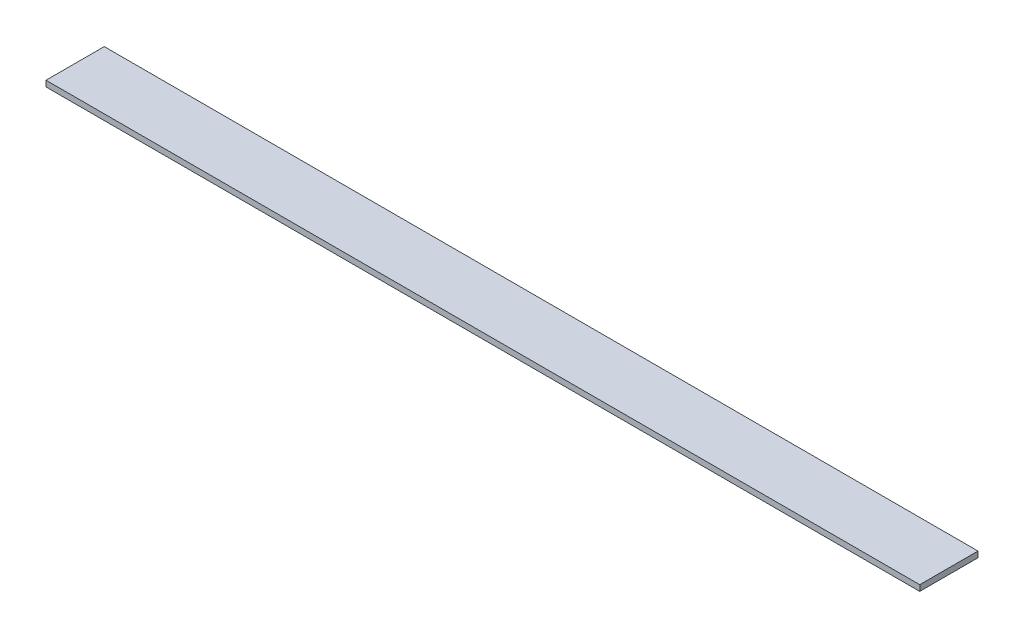
ISO-10303-21;
HEADER;
FILE_DESCRIPTION(('STEP AP214'),'2;1');
FILE_NAME('part.step','',(''),(''),'','','');
FILE_SCHEMA(('AUTOMOTIVE_DESIGN { 1 0 10303 214 1 1 1 1 }'));
ENDSEC;
DATA;
#1=APPLICATION_CONTEXT('core data for automotive mechanical design processes');
#2=APPLICATION_PROTOCOL_DEFINITION('international standard','automotive_design',2000,#1);
#3=PRODUCT_CONTEXT('',#1,'mechanical');
#4=PRODUCT('Part','Part','',(#3));
#5=PRODUCT_RELATED_PRODUCT_CATEGORY('part','',(#4));
#6=PRODUCT_DEFINITION_FORMATION('','',#4);
#7=PRODUCT_DEFINITION_CONTEXT('part definition',#1,'design');
#8=PRODUCT_DEFINITION('design','',#6,#7);
#9=PRODUCT_DEFINITION_SHAPE('','',#8);
#10=(LENGTH_UNIT() NAMED_UNIT(*) SI_UNIT(.MILLI.,.METRE.));
#11=(NAMED_UNIT(*) PLANE_ANGLE_UNIT() SI_UNIT($,.RADIAN.));
#12=(NAMED_UNIT(*) SI_UNIT($,.STERADIAN.) SOLID_ANGLE_UNIT());
#13=UNCERTAINTY_MEASURE_WITH_UNIT(LENGTH_MEASURE(1.E-05),#10,'distance_accuracy_value','');
#14=(GEOMETRIC_REPRESENTATION_CONTEXT(3) GLOBAL_UNCERTAINTY_ASSIGNED_CONTEXT((#13)) GLOBAL_UNIT_ASSIGNED_CONTEXT((#10,
#11,#12)) REPRESENTATION_CONTEXT('',''));
#15=CARTESIAN_POINT('',(0.,0.,0.));
#16=DIRECTION('',(0.,0.,1.));
#17=DIRECTION('',(1.,0.,0.));
#18=AXIS2_PLACEMENT_3D('',#15,#16,#17);
#19=CARTESIAN_POINT('',(381.,0.,0.));
#20=DIRECTION('',(0.,0.,-1.));
#21=DIRECTION('',(0.,1.,0.));
#22=AXIS2_PLACEMENT_3D('',#19,#20,#21);
#23=PLANE('',#22);
#24=DIRECTION('',(0.,-1.,0.));
#25=VECTOR('',#24,1.);
#26=CARTESIAN_POINT('',(0.,0.,0.));
#27=LINE('',#26,#25);
#28=CARTESIAN_POINT('',(0.,2.54,0.));
#29=VERTEX_POINT('',#28);
#30=CARTESIAN_POINT('',(0.,0.,0.));
#31=VERTEX_POINT('',#30);
#32=EDGE_CURVE('E96',#29,#31,#27,.T.);
#33=ORIENTED_EDGE('',*,*,#32,.T.);
#34=DIRECTION('',(-1.,0.,0.));
#35=VECTOR('',#34,1.);
#36=CARTESIAN_POINT('',(381.,0.,0.));
#37=LINE('',#36,#35);
#38=CARTESIAN_POINT('',(381.,0.,0.));
#39=VERTEX_POINT('',#38);
#40=EDGE_CURVE('E11',#39,#31,#37,.T.);
#41=ORIENTED_EDGE('',*,*,#40,.F.);
#42=DIRECTION('',(0.,-1.,0.));
#43=VECTOR('',#42,1.);
#44=CARTESIAN_POINT('',(381.,0.,0.));
#45=LINE('',#44,#43);
#46=CARTESIAN_POINT('',(381.,2.54,0.));
#47=VERTEX_POINT('',#46);
#48=EDGE_CURVE('E84',#47,#39,#45,.T.);
#49=ORIENTED_EDGE('',*,*,#48,.F.);
#50=DIRECTION('',(-1.,0.,0.));
#51=VECTOR('',#50,1.);
#52=CARTESIAN_POINT('',(381.,2.54,0.));
#53=LINE('',#52,#51);
#54=EDGE_CURVE('E92',#47,#29,#53,.T.);
#55=ORIENTED_EDGE('',*,*,#54,.T.);
#56=EDGE_LOOP('',(#33,#41,#49,#55));
#57=FACE_BOUND('',#56,.T.);
#58=ADVANCED_FACE('F33',(#57),#23,.F.);
#59=CARTESIAN_POINT('',(381.,0.,0.));
#60=DIRECTION('',(0.,1.,0.));
#61=DIRECTION('',(0.,0.,1.));
#62=AXIS2_PLACEMENT_3D('',#59,#60,#61);
#63=PLANE('',#62);
#64=DIRECTION('',(0.,0.,-1.));
#65=VECTOR('',#64,1.);
#66=CARTESIAN_POINT('',(0.,0.,0.));
#67=LINE('',#66,#65);
#68=CARTESIAN_POINT('',(0.,0.,-25.4));
#69=VERTEX_POINT('',#68);
#70=EDGE_CURVE('E88',#31,#69,#67,.T.);
#71=ORIENTED_EDGE('',*,*,#70,.T.);
#72=DIRECTION('',(-1.,0.,0.));
#73=VECTOR('',#72,1.);
#74=CARTESIAN_POINT('',(381.,0.,-25.4));
#75=LINE('',#74,#73);
#76=CARTESIAN_POINT('',(381.,0.,-25.4));
#77=VERTEX_POINT('',#76);
#78=EDGE_CURVE('E41',#77,#69,#75,.T.);
#79=ORIENTED_EDGE('',*,*,#78,.F.);
#80=DIRECTION('',(0.,0.,-1.));
#81=VECTOR('',#80,1.);
#82=CARTESIAN_POINT('',(381.,0.,0.));
#83=LINE('',#82,#81);
#84=EDGE_CURVE('E79',#39,#77,#83,.T.);
#85=ORIENTED_EDGE('',*,*,#84,.F.);
#86=ORIENTED_EDGE('',*,*,#40,.T.);
#87=EDGE_LOOP('',(#71,#79,#85,#86));
#88=FACE_BOUND('',#87,.T.);
#89=ADVANCED_FACE('F87',(#88),#63,.F.);
#90=CARTESIAN_POINT('',(381.,0.,-25.4));
#91=DIRECTION('',(0.,0.,1.));
#92=DIRECTION('',(1.,0.,0.));
#93=AXIS2_PLACEMENT_3D('',#90,#91,#92);
#94=PLANE('',#93);
#95=DIRECTION('',(0.,1.,0.));
#96=VECTOR('',#95,1.);
#97=CARTESIAN_POINT('',(0.,0.,-25.4));
#98=LINE('',#97,#96);
#99=CARTESIAN_POINT('',(0.,2.54,-25.4));
#100=VERTEX_POINT('',#99);
#101=EDGE_CURVE('E66',#69,#100,#98,.T.);
#102=ORIENTED_EDGE('',*,*,#101,.T.);
#103=DIRECTION('',(-1.,0.,0.));
#104=VECTOR('',#103,1.);
#105=CARTESIAN_POINT('',(381.,2.54,-25.4));
#106=LINE('',#105,#104);
#107=CARTESIAN_POINT('',(381.,2.54,-25.4));
#108=VERTEX_POINT('',#107);
#109=EDGE_CURVE('E89',#108,#100,#106,.T.);
#110=ORIENTED_EDGE('',*,*,#109,.F.);
#111=DIRECTION('',(0.,1.,0.));
#112=VECTOR('',#111,1.);
#113=CARTESIAN_POINT('',(381.,0.,-25.4));
#114=LINE('',#113,#112);
#115=EDGE_CURVE('E82',#77,#108,#114,.T.);
#116=ORIENTED_EDGE('',*,*,#115,.F.);
#117=ORIENTED_EDGE('',*,*,#78,.T.);
#118=EDGE_LOOP('',(#102,#110,#116,#117));
#119=FACE_BOUND('',#118,.T.);
#120=ADVANCED_FACE('F90',(#119),#94,.F.);
#121=CARTESIAN_POINT('',(381.,2.54,0.));
#122=DIRECTION('',(0.,-1.,0.));
#123=DIRECTION('',(0.,0.,-1.));
#124=AXIS2_PLACEMENT_3D('',#121,#122,#123);
#125=PLANE('',#124);
#126=DIRECTION('',(0.,0.,1.));
#127=VECTOR('',#126,1.);
#128=CARTESIAN_POINT('',(0.,2.54,0.));
#129=LINE('',#128,#127);
#130=EDGE_CURVE('E72',#100,#29,#129,.T.);
#131=ORIENTED_EDGE('',*,*,#130,.T.);
#132=ORIENTED_EDGE('',*,*,#54,.F.);
#133=DIRECTION('',(0.,0.,1.));
#134=VECTOR('',#133,1.);
#135=CARTESIAN_POINT('',(381.,2.54,0.));
#136=LINE('',#135,#134);
#137=EDGE_CURVE('E49',#108,#47,#136,.T.);
#138=ORIENTED_EDGE('',*,*,#137,.F.);
#139=ORIENTED_EDGE('',*,*,#109,.T.);
#140=EDGE_LOOP('',(#131,#132,#138,#139));
#141=FACE_BOUND('',#140,.T.);
#142=ADVANCED_FACE('F103',(#141),#125,.F.);
#143=CARTESIAN_POINT('',(381.,0.,0.));
#144=DIRECTION('',(-1.,0.,0.));
#145=DIRECTION('',(0.,0.,1.));
#146=AXIS2_PLACEMENT_3D('',#143,#144,#145);
#147=PLANE('',#146);
#148=ORIENTED_EDGE('',*,*,#48,.T.);
#149=ORIENTED_EDGE('',*,*,#84,.T.);
#150=ORIENTED_EDGE('',*,*,#115,.T.);
#151=ORIENTED_EDGE('',*,*,#137,.T.);
#152=EDGE_LOOP('',(#148,#149,#150,#151));
#153=FACE_BOUND('',#152,.T.);
#154=ADVANCED_FACE('F80',(#153),#147,.F.);
#155=CARTESIAN_POINT('',(0.,0.,0.));
#156=DIRECTION('',(-1.,0.,0.));
#157=DIRECTION('',(0.,0.,1.));
#158=AXIS2_PLACEMENT_3D('',#155,#156,#157);
#159=PLANE('',#158);
#160=ORIENTED_EDGE('',*,*,#32,.F.);
#161=ORIENTED_EDGE('',*,*,#130,.F.);
#162=ORIENTED_EDGE('',*,*,#101,.F.);
#163=ORIENTED_EDGE('',*,*,#70,.F.);
#164=EDGE_LOOP('',(#160,#161,#162,#163));
#165=FACE_BOUND('',#164,.T.);
#166=ADVANCED_FACE('F106',(#165),#159,.T.);
#167=CLOSED_SHELL('',(#58,#89,#120,#142,#154,#166));
#168=MANIFOLD_SOLID_BREP('B2',#167);
#169=ADVANCED_BREP_SHAPE_REPRESENTATION('',(#18,#168),#14);
#170=SHAPE_DEFINITION_REPRESENTATION(#9,#169);
ENDSEC;
END-ISO-10303-21;
